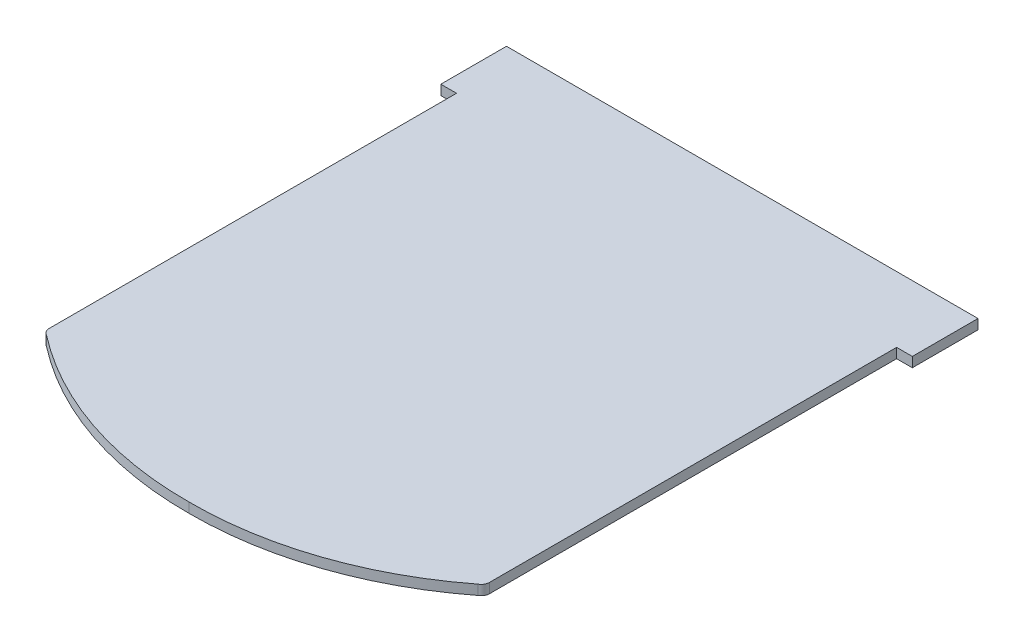
ISO-10303-21;
HEADER;
FILE_DESCRIPTION(('STEP AP214'),'2;1');
FILE_NAME('part.step','',(''),(''),'','','');
FILE_SCHEMA(('AUTOMOTIVE_DESIGN { 1 0 10303 214 1 1 1 1 }'));
ENDSEC;
DATA;
#1=APPLICATION_CONTEXT('core data for automotive mechanical design processes');
#2=APPLICATION_PROTOCOL_DEFINITION('international standard','automotive_design',2000,#1);
#3=PRODUCT_CONTEXT('',#1,'mechanical');
#4=PRODUCT('Part','Part','',(#3));
#5=PRODUCT_RELATED_PRODUCT_CATEGORY('part','',(#4));
#6=PRODUCT_DEFINITION_FORMATION('','',#4);
#7=PRODUCT_DEFINITION_CONTEXT('part definition',#1,'design');
#8=PRODUCT_DEFINITION('design','',#6,#7);
#9=PRODUCT_DEFINITION_SHAPE('','',#8);
#10=(LENGTH_UNIT() NAMED_UNIT(*) SI_UNIT(.MILLI.,.METRE.));
#11=(NAMED_UNIT(*) PLANE_ANGLE_UNIT() SI_UNIT($,.RADIAN.));
#12=(NAMED_UNIT(*) SI_UNIT($,.STERADIAN.) SOLID_ANGLE_UNIT());
#13=UNCERTAINTY_MEASURE_WITH_UNIT(LENGTH_MEASURE(1.E-05),#10,'distance_accuracy_value','');
#14=(GEOMETRIC_REPRESENTATION_CONTEXT(3) GLOBAL_UNCERTAINTY_ASSIGNED_CONTEXT((#13)) GLOBAL_UNIT_ASSIGNED_CONTEXT((#10,
#11,#12)) REPRESENTATION_CONTEXT('',''));
#15=CARTESIAN_POINT('',(0.,0.,0.));
#16=DIRECTION('',(0.,0.,1.));
#17=DIRECTION('',(1.,0.,0.));
#18=AXIS2_PLACEMENT_3D('',#15,#16,#17);
#19=CARTESIAN_POINT('',(-212.725,9.525,-228.6));
#20=DIRECTION('',(0.,0.,1.));
#21=DIRECTION('',(1.,0.,0.));
#22=AXIS2_PLACEMENT_3D('',#19,#20,#21);
#23=PLANE('',#22);
#24=DIRECTION('',(-1.,0.,0.));
#25=VECTOR('',#24,1.);
#26=CARTESIAN_POINT('',(-212.725,0.,-228.6));
#27=LINE('',#26,#25);
#28=CARTESIAN_POINT('',(227.9015,0.,-228.6));
#29=VERTEX_POINT('',#28);
#30=CARTESIAN_POINT('',(-227.9015,0.,-228.6));
#31=VERTEX_POINT('',#30);
#32=EDGE_CURVE('E109',#29,#31,#27,.T.);
#33=ORIENTED_EDGE('',*,*,#32,.T.);
#34=DIRECTION('',(0.,-1.,0.));
#35=VECTOR('',#34,1.);
#36=CARTESIAN_POINT('',(-227.9015,9.525,-228.6));
#37=LINE('',#36,#35);
#38=CARTESIAN_POINT('',(-227.9015,9.525,-228.6));
#39=VERTEX_POINT('',#38);
#40=EDGE_CURVE('E11',#39,#31,#37,.T.);
#41=ORIENTED_EDGE('',*,*,#40,.F.);
#42=DIRECTION('',(-1.,0.,0.));
#43=VECTOR('',#42,1.);
#44=CARTESIAN_POINT('',(212.725,9.525,-228.6));
#45=LINE('',#44,#43);
#46=CARTESIAN_POINT('',(227.9015,9.525,-228.6));
#47=VERTEX_POINT('',#46);
#48=EDGE_CURVE('E115',#47,#39,#45,.T.);
#49=ORIENTED_EDGE('',*,*,#48,.F.);
#50=DIRECTION('',(0.,-1.,0.));
#51=VECTOR('',#50,1.);
#52=CARTESIAN_POINT('',(227.9015,9.525,-228.6));
#53=LINE('',#52,#51);
#54=EDGE_CURVE('E164',#47,#29,#53,.T.);
#55=ORIENTED_EDGE('',*,*,#54,.T.);
#56=EDGE_LOOP('',(#33,#41,#49,#55));
#57=FACE_BOUND('',#56,.T.);
#58=ADVANCED_FACE('F39',(#57),#23,.F.);
#59=CARTESIAN_POINT('',(-227.9015,9.525,-228.6));
#60=DIRECTION('',(1.,0.,0.));
#61=DIRECTION('',(0.,0.,-1.));
#62=AXIS2_PLACEMENT_3D('',#59,#60,#61);
#63=PLANE('',#62);
#64=DIRECTION('',(0.,0.,1.));
#65=VECTOR('',#64,1.);
#66=CARTESIAN_POINT('',(-227.9015,0.,-228.6));
#67=LINE('',#66,#65);
#68=CARTESIAN_POINT('',(-227.9015,0.,-165.1));
#69=VERTEX_POINT('',#68);
#70=EDGE_CURVE('E170',#31,#69,#67,.T.);
#71=ORIENTED_EDGE('',*,*,#70,.T.);
#72=DIRECTION('',(0.,-1.,0.));
#73=VECTOR('',#72,1.);
#74=CARTESIAN_POINT('',(-227.9015,9.525,-165.1));
#75=LINE('',#74,#73);
#76=CARTESIAN_POINT('',(-227.9015,9.525,-165.1));
#77=VERTEX_POINT('',#76);
#78=EDGE_CURVE('E47',#77,#69,#75,.T.);
#79=ORIENTED_EDGE('',*,*,#78,.F.);
#80=DIRECTION('',(0.,0.,1.));
#81=VECTOR('',#80,1.);
#82=CARTESIAN_POINT('',(-227.9015,9.525,-228.6));
#83=LINE('',#82,#81);
#84=EDGE_CURVE('E263',#39,#77,#83,.T.);
#85=ORIENTED_EDGE('',*,*,#84,.F.);
#86=ORIENTED_EDGE('',*,*,#40,.T.);
#87=EDGE_LOOP('',(#71,#79,#85,#86));
#88=FACE_BOUND('',#87,.T.);
#89=ADVANCED_FACE('F266',(#88),#63,.F.);
#90=CARTESIAN_POINT('',(-212.725,9.525,-165.1));
#91=DIRECTION('',(0.,0.,-1.));
#92=DIRECTION('',(-1.,0.,0.));
#93=AXIS2_PLACEMENT_3D('',#90,#91,#92);
#94=PLANE('',#93);
#95=DIRECTION('',(1.,0.,0.));
#96=VECTOR('',#95,1.);
#97=CARTESIAN_POINT('',(-212.725,0.,-165.1));
#98=LINE('',#97,#96);
#99=CARTESIAN_POINT('',(-212.725,0.,-165.1));
#100=VERTEX_POINT('',#99);
#101=EDGE_CURVE('E172',#69,#100,#98,.T.);
#102=ORIENTED_EDGE('',*,*,#101,.T.);
#103=DIRECTION('',(0.,-1.,0.));
#104=VECTOR('',#103,1.);
#105=CARTESIAN_POINT('',(-212.725,9.525,-165.1));
#106=LINE('',#105,#104);
#107=CARTESIAN_POINT('',(-212.725,9.525,-165.1));
#108=VERTEX_POINT('',#107);
#109=EDGE_CURVE('E213',#108,#100,#106,.T.);
#110=ORIENTED_EDGE('',*,*,#109,.F.);
#111=DIRECTION('',(1.,0.,0.));
#112=VECTOR('',#111,1.);
#113=CARTESIAN_POINT('',(-212.725,9.525,-165.1));
#114=LINE('',#113,#112);
#115=EDGE_CURVE('E222',#77,#108,#114,.T.);
#116=ORIENTED_EDGE('',*,*,#115,.F.);
#117=ORIENTED_EDGE('',*,*,#78,.T.);
#118=EDGE_LOOP('',(#102,#110,#116,#117));
#119=FACE_BOUND('',#118,.T.);
#120=ADVANCED_FACE('F220',(#119),#94,.F.);
#121=CARTESIAN_POINT('',(-212.725,9.525,228.6));
#122=DIRECTION('',(1.,0.,0.));
#123=DIRECTION('',(0.,0.,-1.));
#124=AXIS2_PLACEMENT_3D('',#121,#122,#123);
#125=PLANE('',#124);
#126=DIRECTION('',(0.,0.,1.));
#127=VECTOR('',#126,1.);
#128=CARTESIAN_POINT('',(-212.725,0.,228.6));
#129=LINE('',#128,#127);
#130=CARTESIAN_POINT('',(-212.725,0.,228.6));
#131=VERTEX_POINT('',#130);
#132=EDGE_CURVE('E174',#100,#131,#129,.T.);
#133=ORIENTED_EDGE('',*,*,#132,.T.);
#134=DIRECTION('',(0.,-1.,0.));
#135=VECTOR('',#134,1.);
#136=CARTESIAN_POINT('',(-212.725,9.525,228.6));
#137=LINE('',#136,#135);
#138=CARTESIAN_POINT('',(-212.725,9.525,228.6));
#139=VERTEX_POINT('',#138);
#140=EDGE_CURVE('E209',#139,#131,#137,.T.);
#141=ORIENTED_EDGE('',*,*,#140,.F.);
#142=DIRECTION('',(0.,0.,1.));
#143=VECTOR('',#142,1.);
#144=CARTESIAN_POINT('',(-212.725,9.525,228.6));
#145=LINE('',#144,#143);
#146=EDGE_CURVE('E241',#108,#139,#145,.T.);
#147=ORIENTED_EDGE('',*,*,#146,.F.);
#148=ORIENTED_EDGE('',*,*,#109,.T.);
#149=EDGE_LOOP('',(#133,#141,#147,#148));
#150=FACE_BOUND('',#149,.T.);
#151=ADVANCED_FACE('F231',(#150),#125,.F.);
#152=CARTESIAN_POINT('',(-204.831856788448,9.525,228.476227655902));
#153=DIRECTION('',(0.,-1.,0.));
#154=DIRECTION('',(0.,0.,-1.));
#155=AXIS2_PLACEMENT_3D('',#152,#153,#154);
#156=CYLINDRICAL_SURFACE('',#155,7.89411358869562);
#157=CARTESIAN_POINT('',(-204.831856788448,0.,228.476227655902));
#158=DIRECTION('',(0.,1.,0.));
#159=DIRECTION('',(0.,0.,1.));
#160=AXIS2_PLACEMENT_3D('',#157,#158,#159);
#161=CIRCLE('',#160,7.89411358869562);
#162=CARTESIAN_POINT('',(-208.57305382281,0.,235.427520636443));
#163=VERTEX_POINT('',#162);
#164=EDGE_CURVE('E177',#131,#163,#161,.T.);
#165=ORIENTED_EDGE('',*,*,#164,.T.);
#166=DIRECTION('',(0.,-1.,0.));
#167=VECTOR('',#166,1.);
#168=CARTESIAN_POINT('',(-208.57305382281,9.525,235.427520636443));
#169=LINE('',#168,#167);
#170=CARTESIAN_POINT('',(-208.57305382281,9.525,235.427520636443));
#171=VERTEX_POINT('',#170);
#172=EDGE_CURVE('E205',#171,#163,#169,.T.);
#173=ORIENTED_EDGE('',*,*,#172,.F.);
#174=CARTESIAN_POINT('',(-204.831856788448,9.525,228.476227655902));
#175=DIRECTION('',(0.,1.,0.));
#176=DIRECTION('',(0.,0.,1.));
#177=AXIS2_PLACEMENT_3D('',#174,#175,#176);
#178=CIRCLE('',#177,7.89411358869562);
#179=EDGE_CURVE('E237',#139,#171,#178,.T.);
#180=ORIENTED_EDGE('',*,*,#179,.F.);
#181=ORIENTED_EDGE('',*,*,#140,.T.);
#182=EDGE_LOOP('',(#165,#173,#180,#181));
#183=FACE_BOUND('',#182,.T.);
#184=ADVANCED_FACE('F235',(#183),#156,.T.);
#185=CARTESIAN_POINT('',(-1.9096404730294,9.525,-30.0094295800067));
#186=DIRECTION('',(0.,-1.,0.));
#187=DIRECTION('',(0.,0.,-1.));
#188=AXIS2_PLACEMENT_3D('',#185,#186,#187);
#189=CYLINDRICAL_SURFACE('',#188,336.402349809855);
#190=CARTESIAN_POINT('',(-1.9096404730294,0.,-30.0094295800067));
#191=DIRECTION('',(0.,1.,0.));
#192=DIRECTION('',(0.,0.,-1.));
#193=AXIS2_PLACEMENT_3D('',#190,#191,#192);
#194=CIRCLE('',#193,336.402349809855);
#195=CARTESIAN_POINT('',(0.,0.,306.3875));
#196=VERTEX_POINT('',#195);
#197=EDGE_CURVE('E180',#163,#196,#194,.T.);
#198=ORIENTED_EDGE('',*,*,#197,.T.);
#199=DIRECTION('',(0.,-1.,0.));
#200=VECTOR('',#199,1.);
#201=CARTESIAN_POINT('',(0.,9.525,306.3875));
#202=LINE('',#201,#200);
#203=CARTESIAN_POINT('',(0.,9.525,306.3875));
#204=VERTEX_POINT('',#203);
#205=EDGE_CURVE('E202',#204,#196,#202,.T.);
#206=ORIENTED_EDGE('',*,*,#205,.F.);
#207=CARTESIAN_POINT('',(-1.9096404730294,9.525,-30.0094295800067));
#208=DIRECTION('',(0.,1.,0.));
#209=DIRECTION('',(0.,0.,-1.));
#210=AXIS2_PLACEMENT_3D('',#207,#208,#209);
#211=CIRCLE('',#210,336.402349809855);
#212=EDGE_CURVE('E240',#171,#204,#211,.T.);
#213=ORIENTED_EDGE('',*,*,#212,.F.);
#214=ORIENTED_EDGE('',*,*,#172,.T.);
#215=EDGE_LOOP('',(#198,#206,#213,#214));
#216=FACE_BOUND('',#215,.T.);
#217=ADVANCED_FACE('F278',(#216),#189,.T.);
#218=CARTESIAN_POINT('',(1.90964047302934,9.525,-30.0094295800067));
#219=DIRECTION('',(0.,-1.,0.));
#220=DIRECTION('',(0.,0.,-1.));
#221=AXIS2_PLACEMENT_3D('',#218,#219,#220);
#222=CYLINDRICAL_SURFACE('',#221,336.402349809855);
#223=CARTESIAN_POINT('',(1.90964047302934,0.,-30.0094295800067));
#224=DIRECTION('',(0.,1.,0.));
#225=DIRECTION('',(0.,0.,1.));
#226=AXIS2_PLACEMENT_3D('',#223,#224,#225);
#227=CIRCLE('',#226,336.402349809855);
#228=CARTESIAN_POINT('',(208.57305382281,0.,235.427520636443));
#229=VERTEX_POINT('',#228);
#230=EDGE_CURVE('E183',#196,#229,#227,.T.);
#231=ORIENTED_EDGE('',*,*,#230,.T.);
#232=DIRECTION('',(0.,-1.,0.));
#233=VECTOR('',#232,1.);
#234=CARTESIAN_POINT('',(208.57305382281,9.525,235.427520636443));
#235=LINE('',#234,#233);
#236=CARTESIAN_POINT('',(208.57305382281,9.525,235.427520636443));
#237=VERTEX_POINT('',#236);
#238=EDGE_CURVE('E199',#237,#229,#235,.T.);
#239=ORIENTED_EDGE('',*,*,#238,.F.);
#240=CARTESIAN_POINT('',(1.90964047302934,9.525,-30.0094295800067));
#241=DIRECTION('',(0.,1.,0.));
#242=DIRECTION('',(0.,0.,1.));
#243=AXIS2_PLACEMENT_3D('',#240,#241,#242);
#244=CIRCLE('',#243,336.402349809855);
#245=EDGE_CURVE('E244',#204,#237,#244,.T.);
#246=ORIENTED_EDGE('',*,*,#245,.F.);
#247=ORIENTED_EDGE('',*,*,#205,.T.);
#248=EDGE_LOOP('',(#231,#239,#246,#247));
#249=FACE_BOUND('',#248,.T.);
#250=ADVANCED_FACE('F254',(#249),#222,.T.);
#251=CARTESIAN_POINT('',(204.831856788448,9.525,228.476227655902));
#252=DIRECTION('',(0.,-1.,0.));
#253=DIRECTION('',(0.,0.,-1.));
#254=AXIS2_PLACEMENT_3D('',#251,#252,#253);
#255=CYLINDRICAL_SURFACE('',#254,7.89411358869562);
#256=CARTESIAN_POINT('',(204.831856788448,0.,228.476227655902));
#257=DIRECTION('',(0.,1.,0.));
#258=DIRECTION('',(0.,0.,-1.));
#259=AXIS2_PLACEMENT_3D('',#256,#257,#258);
#260=CIRCLE('',#259,7.89411358869562);
#261=CARTESIAN_POINT('',(212.725,0.,228.6));
#262=VERTEX_POINT('',#261);
#263=EDGE_CURVE('E185',#229,#262,#260,.T.);
#264=ORIENTED_EDGE('',*,*,#263,.T.);
#265=DIRECTION('',(0.,-1.,0.));
#266=VECTOR('',#265,1.);
#267=CARTESIAN_POINT('',(212.725,9.525,228.6));
#268=LINE('',#267,#266);
#269=CARTESIAN_POINT('',(212.725,9.525,228.6));
#270=VERTEX_POINT('',#269);
#271=EDGE_CURVE('E156',#270,#262,#268,.T.);
#272=ORIENTED_EDGE('',*,*,#271,.F.);
#273=CARTESIAN_POINT('',(204.831856788448,9.525,228.476227655902));
#274=DIRECTION('',(0.,1.,0.));
#275=DIRECTION('',(0.,0.,-1.));
#276=AXIS2_PLACEMENT_3D('',#273,#274,#275);
#277=CIRCLE('',#276,7.89411358869562);
#278=EDGE_CURVE('E145',#237,#270,#277,.T.);
#279=ORIENTED_EDGE('',*,*,#278,.F.);
#280=ORIENTED_EDGE('',*,*,#238,.T.);
#281=EDGE_LOOP('',(#264,#272,#279,#280));
#282=FACE_BOUND('',#281,.T.);
#283=ADVANCED_FACE('F258',(#282),#255,.T.);
#284=CARTESIAN_POINT('',(212.725,9.525,228.6));
#285=DIRECTION('',(-1.,0.,0.));
#286=DIRECTION('',(0.,0.,1.));
#287=AXIS2_PLACEMENT_3D('',#284,#285,#286);
#288=PLANE('',#287);
#289=DIRECTION('',(0.,0.,-1.));
#290=VECTOR('',#289,1.);
#291=CARTESIAN_POINT('',(212.725,0.,228.6));
#292=LINE('',#291,#290);
#293=CARTESIAN_POINT('',(212.725,0.,-165.1));
#294=VERTEX_POINT('',#293);
#295=EDGE_CURVE('E154',#262,#294,#292,.T.);
#296=ORIENTED_EDGE('',*,*,#295,.T.);
#297=DIRECTION('',(0.,-1.,0.));
#298=VECTOR('',#297,1.);
#299=CARTESIAN_POINT('',(212.725,9.525,-165.1));
#300=LINE('',#299,#298);
#301=CARTESIAN_POINT('',(212.725,9.525,-165.1));
#302=VERTEX_POINT('',#301);
#303=EDGE_CURVE('E151',#302,#294,#300,.T.);
#304=ORIENTED_EDGE('',*,*,#303,.F.);
#305=DIRECTION('',(0.,0.,-1.));
#306=VECTOR('',#305,1.);
#307=CARTESIAN_POINT('',(212.725,9.525,228.6));
#308=LINE('',#307,#306);
#309=EDGE_CURVE('E139',#270,#302,#308,.T.);
#310=ORIENTED_EDGE('',*,*,#309,.F.);
#311=ORIENTED_EDGE('',*,*,#271,.T.);
#312=EDGE_LOOP('',(#296,#304,#310,#311));
#313=FACE_BOUND('',#312,.T.);
#314=ADVANCED_FACE('F152',(#313),#288,.F.);
#315=CARTESIAN_POINT('',(212.725,9.525,-165.1));
#316=DIRECTION('',(0.,0.,-1.));
#317=DIRECTION('',(-1.,0.,0.));
#318=AXIS2_PLACEMENT_3D('',#315,#316,#317);
#319=PLANE('',#318);
#320=DIRECTION('',(1.,0.,0.));
#321=VECTOR('',#320,1.);
#322=CARTESIAN_POINT('',(212.725,0.,-165.1));
#323=LINE('',#322,#321);
#324=CARTESIAN_POINT('',(227.9015,0.,-165.1));
#325=VERTEX_POINT('',#324);
#326=EDGE_CURVE('E101',#294,#325,#323,.T.);
#327=ORIENTED_EDGE('',*,*,#326,.T.);
#328=DIRECTION('',(0.,-1.,0.));
#329=VECTOR('',#328,1.);
#330=CARTESIAN_POINT('',(227.9015,9.525,-165.1));
#331=LINE('',#330,#329);
#332=CARTESIAN_POINT('',(227.9015,9.525,-165.1));
#333=VERTEX_POINT('',#332);
#334=EDGE_CURVE('E157',#333,#325,#331,.T.);
#335=ORIENTED_EDGE('',*,*,#334,.F.);
#336=DIRECTION('',(1.,0.,0.));
#337=VECTOR('',#336,1.);
#338=CARTESIAN_POINT('',(212.725,9.525,-165.1));
#339=LINE('',#338,#337);
#340=EDGE_CURVE('E143',#302,#333,#339,.T.);
#341=ORIENTED_EDGE('',*,*,#340,.F.);
#342=ORIENTED_EDGE('',*,*,#303,.T.);
#343=EDGE_LOOP('',(#327,#335,#341,#342));
#344=FACE_BOUND('',#343,.T.);
#345=ADVANCED_FACE('F159',(#344),#319,.F.);
#346=CARTESIAN_POINT('',(227.9015,9.525,-228.6));
#347=DIRECTION('',(-1.,0.,0.));
#348=DIRECTION('',(0.,0.,1.));
#349=AXIS2_PLACEMENT_3D('',#346,#347,#348);
#350=PLANE('',#349);
#351=DIRECTION('',(0.,0.,-1.));
#352=VECTOR('',#351,1.);
#353=CARTESIAN_POINT('',(227.9015,0.,-228.6));
#354=LINE('',#353,#352);
#355=EDGE_CURVE('E190',#325,#29,#354,.T.);
#356=ORIENTED_EDGE('',*,*,#355,.T.);
#357=ORIENTED_EDGE('',*,*,#54,.F.);
#358=DIRECTION('',(0.,0.,-1.));
#359=VECTOR('',#358,1.);
#360=CARTESIAN_POINT('',(227.9015,9.525,-228.6));
#361=LINE('',#360,#359);
#362=EDGE_CURVE('E57',#333,#47,#361,.T.);
#363=ORIENTED_EDGE('',*,*,#362,.F.);
#364=ORIENTED_EDGE('',*,*,#334,.T.);
#365=EDGE_LOOP('',(#356,#357,#363,#364));
#366=FACE_BOUND('',#365,.T.);
#367=ADVANCED_FACE('F260',(#366),#350,.F.);
#368=CARTESIAN_POINT('',(204.831856788448,9.525,228.476227655902));
#369=DIRECTION('',(0.,-1.,0.));
#370=DIRECTION('',(0.,0.,-1.));
#371=AXIS2_PLACEMENT_3D('',#368,#369,#370);
#372=PLANE('',#371);
#373=ORIENTED_EDGE('',*,*,#48,.T.);
#374=ORIENTED_EDGE('',*,*,#84,.T.);
#375=ORIENTED_EDGE('',*,*,#115,.T.);
#376=ORIENTED_EDGE('',*,*,#146,.T.);
#377=ORIENTED_EDGE('',*,*,#179,.T.);
#378=ORIENTED_EDGE('',*,*,#212,.T.);
#379=ORIENTED_EDGE('',*,*,#245,.T.);
#380=ORIENTED_EDGE('',*,*,#278,.T.);
#381=ORIENTED_EDGE('',*,*,#309,.T.);
#382=ORIENTED_EDGE('',*,*,#340,.T.);
#383=ORIENTED_EDGE('',*,*,#362,.T.);
#384=EDGE_LOOP('',(#373,#374,#375,#376,#377,#378,#379,#380,#381,#382,#383));
#385=FACE_BOUND('',#384,.T.);
#386=ADVANCED_FACE('F141',(#385),#372,.F.);
#387=CARTESIAN_POINT('',(204.831856788448,0.,228.476227655902));
#388=DIRECTION('',(0.,-1.,0.));
#389=DIRECTION('',(0.,0.,-1.));
#390=AXIS2_PLACEMENT_3D('',#387,#388,#389);
#391=PLANE('',#390);
#392=ORIENTED_EDGE('',*,*,#32,.F.);
#393=ORIENTED_EDGE('',*,*,#355,.F.);
#394=ORIENTED_EDGE('',*,*,#326,.F.);
#395=ORIENTED_EDGE('',*,*,#295,.F.);
#396=ORIENTED_EDGE('',*,*,#263,.F.);
#397=ORIENTED_EDGE('',*,*,#230,.F.);
#398=ORIENTED_EDGE('',*,*,#197,.F.);
#399=ORIENTED_EDGE('',*,*,#164,.F.);
#400=ORIENTED_EDGE('',*,*,#132,.F.);
#401=ORIENTED_EDGE('',*,*,#101,.F.);
#402=ORIENTED_EDGE('',*,*,#70,.F.);
#403=EDGE_LOOP('',(#392,#393,#394,#395,#396,#397,#398,#399,#400,#401,#402));
#404=FACE_BOUND('',#403,.T.);
#405=ADVANCED_FACE('F226',(#404),#391,.T.);
#406=CLOSED_SHELL('',(#58,#89,#120,#151,#184,#217,#250,#283,#314,#345,#367,#386,#405));
#407=MANIFOLD_SOLID_BREP('B2',#406);
#408=ADVANCED_BREP_SHAPE_REPRESENTATION('',(#18,#407),#14);
#409=SHAPE_DEFINITION_REPRESENTATION(#9,#408);
ENDSEC;
END-ISO-10303-21;
